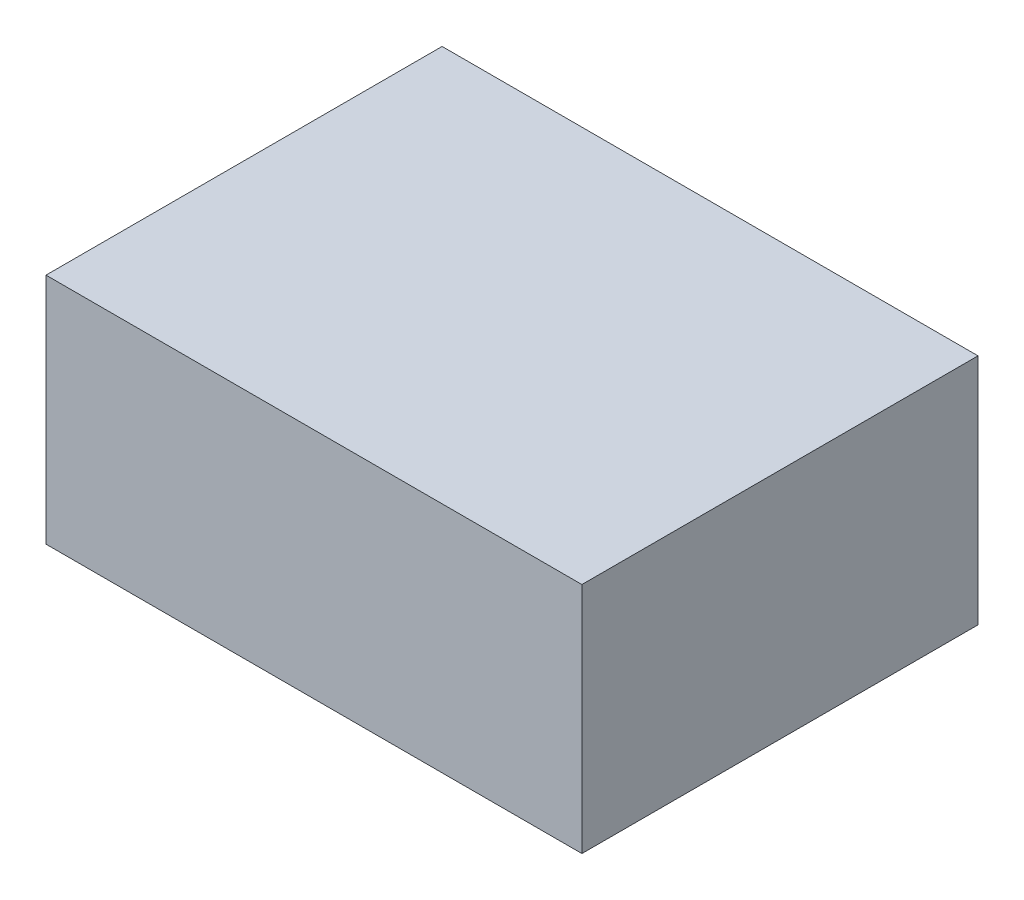
ISO-10303-21;
HEADER;
FILE_DESCRIPTION(('STEP AP214'),'2;1');
FILE_NAME('part.step','',(''),(''),'','','');
FILE_SCHEMA(('AUTOMOTIVE_DESIGN { 1 0 10303 214 1 1 1 1 }'));
ENDSEC;
DATA;
#1=APPLICATION_CONTEXT('core data for automotive mechanical design processes');
#2=APPLICATION_PROTOCOL_DEFINITION('international standard','automotive_design',2000,#1);
#3=PRODUCT_CONTEXT('',#1,'mechanical');
#4=PRODUCT('Part','Part','',(#3));
#5=PRODUCT_RELATED_PRODUCT_CATEGORY('part','',(#4));
#6=PRODUCT_DEFINITION_FORMATION('','',#4);
#7=PRODUCT_DEFINITION_CONTEXT('part definition',#1,'design');
#8=PRODUCT_DEFINITION('design','',#6,#7);
#9=PRODUCT_DEFINITION_SHAPE('','',#8);
#10=(LENGTH_UNIT() NAMED_UNIT(*) SI_UNIT(.MILLI.,.METRE.));
#11=(NAMED_UNIT(*) PLANE_ANGLE_UNIT() SI_UNIT($,.RADIAN.));
#12=(NAMED_UNIT(*) SI_UNIT($,.STERADIAN.) SOLID_ANGLE_UNIT());
#13=UNCERTAINTY_MEASURE_WITH_UNIT(LENGTH_MEASURE(1.E-05),#10,'distance_accuracy_value','');
#14=(GEOMETRIC_REPRESENTATION_CONTEXT(3) GLOBAL_UNCERTAINTY_ASSIGNED_CONTEXT((#13)) GLOBAL_UNIT_ASSIGNED_CONTEXT((#10,
#11,#12)) REPRESENTATION_CONTEXT('',''));
#15=CARTESIAN_POINT('',(0.,0.,0.));
#16=DIRECTION('',(0.,0.,1.));
#17=DIRECTION('',(1.,0.,0.));
#18=AXIS2_PLACEMENT_3D('',#15,#16,#17);
#19=CARTESIAN_POINT('',(0.,100.,0.));
#20=DIRECTION('',(1.,0.,0.));
#21=DIRECTION('',(0.,0.,-1.));
#22=AXIS2_PLACEMENT_3D('',#19,#20,#21);
#23=PLANE('',#22);
#24=DIRECTION('',(0.,0.,1.));
#25=VECTOR('',#24,1.);
#26=CARTESIAN_POINT('',(0.,0.,0.));
#27=LINE('',#26,#25);
#28=CARTESIAN_POINT('',(0.,0.,0.));
#29=VERTEX_POINT('',#28);
#30=CARTESIAN_POINT('',(1.36002320516582E-12,0.,170.));
#31=VERTEX_POINT('',#30);
#32=EDGE_CURVE('E110',#29,#31,#27,.T.);
#33=ORIENTED_EDGE('',*,*,#32,.T.);
#34=DIRECTION('',(0.,-1.,0.));
#35=VECTOR('',#34,1.);
#36=CARTESIAN_POINT('',(1.36002320516582E-12,100.,170.));
#37=LINE('',#36,#35);
#38=CARTESIAN_POINT('',(1.36002320516582E-12,100.,170.));
#39=VERTEX_POINT('',#38);
#40=EDGE_CURVE('E11',#39,#31,#37,.T.);
#41=ORIENTED_EDGE('',*,*,#40,.F.);
#42=DIRECTION('',(0.,0.,1.));
#43=VECTOR('',#42,1.);
#44=CARTESIAN_POINT('',(0.,100.,0.));
#45=LINE('',#44,#43);
#46=CARTESIAN_POINT('',(0.,100.,0.));
#47=VERTEX_POINT('',#46);
#48=EDGE_CURVE('E98',#47,#39,#45,.T.);
#49=ORIENTED_EDGE('',*,*,#48,.F.);
#50=DIRECTION('',(0.,-1.,0.));
#51=VECTOR('',#50,1.);
#52=CARTESIAN_POINT('',(0.,100.,0.));
#53=LINE('',#52,#51);
#54=EDGE_CURVE('E106',#47,#29,#53,.T.);
#55=ORIENTED_EDGE('',*,*,#54,.T.);
#56=EDGE_LOOP('',(#33,#41,#49,#55));
#57=FACE_BOUND('',#56,.T.);
#58=ADVANCED_FACE('F47',(#57),#23,.F.);
#59=CARTESIAN_POINT('',(1.36002320516582E-12,100.,170.));
#60=DIRECTION('',(0.,0.,-1.));
#61=DIRECTION('',(-1.,0.,0.));
#62=AXIS2_PLACEMENT_3D('',#59,#60,#61);
#63=PLANE('',#62);
#64=DIRECTION('',(1.,0.,0.));
#65=VECTOR('',#64,1.);
#66=CARTESIAN_POINT('',(1.36002320516582E-12,0.,170.));
#67=LINE('',#66,#65);
#68=CARTESIAN_POINT('',(229.9999972,0.,170.));
#69=VERTEX_POINT('',#68);
#70=EDGE_CURVE('E102',#31,#69,#67,.T.);
#71=ORIENTED_EDGE('',*,*,#70,.T.);
#72=DIRECTION('',(0.,-1.,0.));
#73=VECTOR('',#72,1.);
#74=CARTESIAN_POINT('',(229.9999972,100.,170.));
#75=LINE('',#74,#73);
#76=CARTESIAN_POINT('',(229.9999972,100.,170.));
#77=VERTEX_POINT('',#76);
#78=EDGE_CURVE('E55',#77,#69,#75,.T.);
#79=ORIENTED_EDGE('',*,*,#78,.F.);
#80=DIRECTION('',(1.,0.,0.));
#81=VECTOR('',#80,1.);
#82=CARTESIAN_POINT('',(1.36002320516582E-12,100.,170.));
#83=LINE('',#82,#81);
#84=EDGE_CURVE('E93',#39,#77,#83,.T.);
#85=ORIENTED_EDGE('',*,*,#84,.F.);
#86=ORIENTED_EDGE('',*,*,#40,.T.);
#87=EDGE_LOOP('',(#71,#79,#85,#86));
#88=FACE_BOUND('',#87,.T.);
#89=ADVANCED_FACE('F101',(#88),#63,.F.);
#90=CARTESIAN_POINT('',(229.9999972,100.,0.));
#91=DIRECTION('',(-1.,0.,0.));
#92=DIRECTION('',(0.,0.,1.));
#93=AXIS2_PLACEMENT_3D('',#90,#91,#92);
#94=PLANE('',#93);
#95=DIRECTION('',(0.,0.,-1.));
#96=VECTOR('',#95,1.);
#97=CARTESIAN_POINT('',(229.9999972,0.,0.));
#98=LINE('',#97,#96);
#99=CARTESIAN_POINT('',(229.9999972,0.,0.));
#100=VERTEX_POINT('',#99);
#101=EDGE_CURVE('E80',#69,#100,#98,.T.);
#102=ORIENTED_EDGE('',*,*,#101,.T.);
#103=DIRECTION('',(0.,-1.,0.));
#104=VECTOR('',#103,1.);
#105=CARTESIAN_POINT('',(229.9999972,100.,0.));
#106=LINE('',#105,#104);
#107=CARTESIAN_POINT('',(229.9999972,100.,0.));
#108=VERTEX_POINT('',#107);
#109=EDGE_CURVE('E103',#108,#100,#106,.T.);
#110=ORIENTED_EDGE('',*,*,#109,.F.);
#111=DIRECTION('',(0.,0.,-1.));
#112=VECTOR('',#111,1.);
#113=CARTESIAN_POINT('',(229.9999972,100.,0.));
#114=LINE('',#113,#112);
#115=EDGE_CURVE('E96',#77,#108,#114,.T.);
#116=ORIENTED_EDGE('',*,*,#115,.F.);
#117=ORIENTED_EDGE('',*,*,#78,.T.);
#118=EDGE_LOOP('',(#102,#110,#116,#117));
#119=FACE_BOUND('',#118,.T.);
#120=ADVANCED_FACE('F104',(#119),#94,.F.);
#121=CARTESIAN_POINT('',(0.,100.,0.));
#122=DIRECTION('',(0.,0.,1.));
#123=DIRECTION('',(1.,0.,0.));
#124=AXIS2_PLACEMENT_3D('',#121,#122,#123);
#125=PLANE('',#124);
#126=DIRECTION('',(-1.,0.,0.));
#127=VECTOR('',#126,1.);
#128=CARTESIAN_POINT('',(0.,0.,0.));
#129=LINE('',#128,#127);
#130=EDGE_CURVE('E86',#100,#29,#129,.T.);
#131=ORIENTED_EDGE('',*,*,#130,.T.);
#132=ORIENTED_EDGE('',*,*,#54,.F.);
#133=DIRECTION('',(-1.,0.,0.));
#134=VECTOR('',#133,1.);
#135=CARTESIAN_POINT('',(0.,100.,0.));
#136=LINE('',#135,#134);
#137=EDGE_CURVE('E63',#108,#47,#136,.T.);
#138=ORIENTED_EDGE('',*,*,#137,.F.);
#139=ORIENTED_EDGE('',*,*,#109,.T.);
#140=EDGE_LOOP('',(#131,#132,#138,#139));
#141=FACE_BOUND('',#140,.T.);
#142=ADVANCED_FACE('F117',(#141),#125,.F.);
#143=CARTESIAN_POINT('',(0.,100.,0.));
#144=DIRECTION('',(0.,1.,0.));
#145=DIRECTION('',(0.,0.,1.));
#146=AXIS2_PLACEMENT_3D('',#143,#144,#145);
#147=PLANE('',#146);
#148=ORIENTED_EDGE('',*,*,#48,.T.);
#149=ORIENTED_EDGE('',*,*,#84,.T.);
#150=ORIENTED_EDGE('',*,*,#115,.T.);
#151=ORIENTED_EDGE('',*,*,#137,.T.);
#152=EDGE_LOOP('',(#148,#149,#150,#151));
#153=FACE_BOUND('',#152,.T.);
#154=ADVANCED_FACE('F94',(#153),#147,.T.);
#155=CARTESIAN_POINT('',(0.,0.,0.));
#156=DIRECTION('',(0.,1.,0.));
#157=DIRECTION('',(0.,0.,1.));
#158=AXIS2_PLACEMENT_3D('',#155,#156,#157);
#159=PLANE('',#158);
#160=ORIENTED_EDGE('',*,*,#32,.F.);
#161=ORIENTED_EDGE('',*,*,#130,.F.);
#162=ORIENTED_EDGE('',*,*,#101,.F.);
#163=ORIENTED_EDGE('',*,*,#70,.F.);
#164=EDGE_LOOP('',(#160,#161,#162,#163));
#165=FACE_BOUND('',#164,.T.);
#166=ADVANCED_FACE('F120',(#165),#159,.F.);
#167=CLOSED_SHELL('',(#58,#89,#120,#142,#154,#166));
#168=MANIFOLD_SOLID_BREP('B2',#167);
#169=ADVANCED_BREP_SHAPE_REPRESENTATION('',(#18,#168),#14);
#170=SHAPE_DEFINITION_REPRESENTATION(#9,#169);
ENDSEC;
END-ISO-10303-21;
